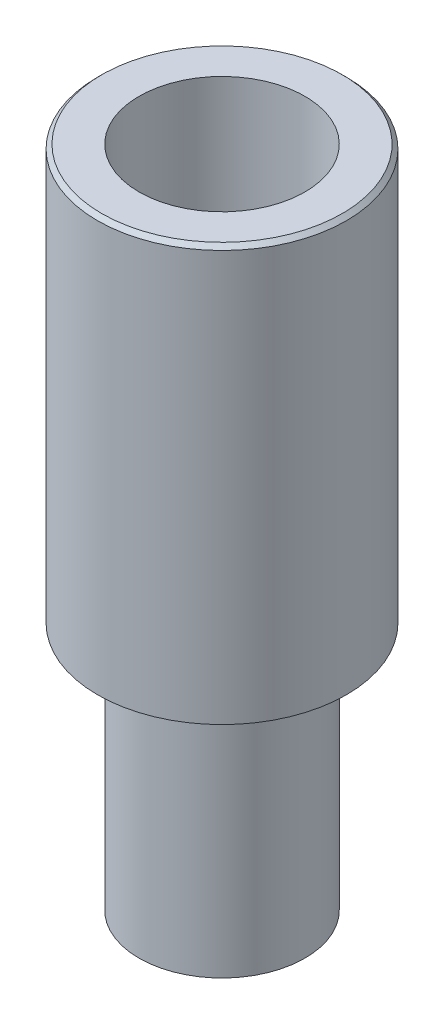
ISO-10303-21;
HEADER;
FILE_DESCRIPTION(('STEP AP214'),'2;1');
FILE_NAME('part.step','',(''),(''),'','','');
FILE_SCHEMA(('AUTOMOTIVE_DESIGN { 1 0 10303 214 1 1 1 1 }'));
ENDSEC;
DATA;
#1=APPLICATION_CONTEXT('core data for automotive mechanical design processes');
#2=APPLICATION_PROTOCOL_DEFINITION('international standard','automotive_design',2000,#1);
#3=PRODUCT_CONTEXT('',#1,'mechanical');
#4=PRODUCT('Part','Part','',(#3));
#5=PRODUCT_RELATED_PRODUCT_CATEGORY('part','',(#4));
#6=PRODUCT_DEFINITION_FORMATION('','',#4);
#7=PRODUCT_DEFINITION_CONTEXT('part definition',#1,'design');
#8=PRODUCT_DEFINITION('design','',#6,#7);
#9=PRODUCT_DEFINITION_SHAPE('','',#8);
#10=(LENGTH_UNIT() NAMED_UNIT(*) SI_UNIT(.MILLI.,.METRE.));
#11=(NAMED_UNIT(*) PLANE_ANGLE_UNIT() SI_UNIT($,.RADIAN.));
#12=(NAMED_UNIT(*) SI_UNIT($,.STERADIAN.) SOLID_ANGLE_UNIT());
#13=UNCERTAINTY_MEASURE_WITH_UNIT(LENGTH_MEASURE(1.E-05),#10,'distance_accuracy_value','');
#14=(GEOMETRIC_REPRESENTATION_CONTEXT(3) GLOBAL_UNCERTAINTY_ASSIGNED_CONTEXT((#13)) GLOBAL_UNIT_ASSIGNED_CONTEXT((#10,
#11,#12)) REPRESENTATION_CONTEXT('',''));
#15=CARTESIAN_POINT('',(0.,0.,0.));
#16=DIRECTION('',(0.,0.,1.));
#17=DIRECTION('',(1.,0.,0.));
#18=AXIS2_PLACEMENT_3D('',#15,#16,#17);
#19=CARTESIAN_POINT('',(0.,6.,0.));
#20=DIRECTION('',(0.,-1.,0.));
#21=DIRECTION('',(0.,0.,-1.));
#22=AXIS2_PLACEMENT_3D('',#19,#20,#21);
#23=CYLINDRICAL_SURFACE('',#22,2.);
#24=CARTESIAN_POINT('',(0.,6.,0.));
#25=DIRECTION('',(0.,1.,0.));
#26=DIRECTION('',(0.,0.,1.));
#27=AXIS2_PLACEMENT_3D('',#24,#25,#26);
#28=CIRCLE('',#27,2.);
#29=CARTESIAN_POINT('',(0.,6.,2.));
#30=VERTEX_POINT('',#29);
#31=EDGE_CURVE('E45',#30,#30,#28,.T.);
#32=ORIENTED_EDGE('',*,*,#31,.F.);
#33=EDGE_LOOP('',(#32));
#34=FACE_BOUND('',#33,.T.);
#35=CARTESIAN_POINT('',(0.,0.,0.));
#36=DIRECTION('',(0.,1.,0.));
#37=DIRECTION('',(0.,0.,1.));
#38=AXIS2_PLACEMENT_3D('',#35,#36,#37);
#39=CIRCLE('',#38,2.);
#40=CARTESIAN_POINT('',(0.,0.,2.));
#41=VERTEX_POINT('',#40);
#42=EDGE_CURVE('E49',#41,#41,#39,.T.);
#43=ORIENTED_EDGE('',*,*,#42,.T.);
#44=EDGE_LOOP('',(#43));
#45=FACE_BOUND('',#44,.T.);
#46=ADVANCED_FACE('F33',(#34,#45),#23,.T.);
#47=CARTESIAN_POINT('',(0.,0.,0.));
#48=DIRECTION('',(0.,1.,0.));
#49=DIRECTION('',(0.,0.,1.));
#50=AXIS2_PLACEMENT_3D('',#47,#48,#49);
#51=PLANE('',#50);
#52=ORIENTED_EDGE('',*,*,#42,.F.);
#53=EDGE_LOOP('',(#52));
#54=FACE_BOUND('',#53,.T.);
#55=ADVANCED_FACE('F84',(#54),#51,.F.);
#56=CARTESIAN_POINT('',(0.,16.,0.));
#57=DIRECTION('',(0.,-1.,0.));
#58=DIRECTION('',(0.,0.,-1.));
#59=AXIS2_PLACEMENT_3D('',#56,#57,#58);
#60=CYLINDRICAL_SURFACE('',#59,3.);
#61=CARTESIAN_POINT('',(0.,15.9,0.));
#62=DIRECTION('',(0.,1.,0.));
#63=DIRECTION('',(0.,0.,1.));
#64=AXIS2_PLACEMENT_3D('',#61,#62,#63);
#65=CIRCLE('',#64,3.);
#66=CARTESIAN_POINT('',(0.,15.9,3.));
#67=VERTEX_POINT('',#66);
#68=EDGE_CURVE('E10',#67,#67,#65,.F.);
#69=ORIENTED_EDGE('',*,*,#68,.T.);
#70=EDGE_LOOP('',(#69));
#71=FACE_BOUND('',#70,.T.);
#72=CARTESIAN_POINT('',(0.,6.,0.));
#73=DIRECTION('',(0.,1.,0.));
#74=DIRECTION('',(0.,0.,1.));
#75=AXIS2_PLACEMENT_3D('',#72,#73,#74);
#76=CIRCLE('',#75,3.);
#77=CARTESIAN_POINT('',(0.,6.,3.));
#78=VERTEX_POINT('',#77);
#79=EDGE_CURVE('E53',#78,#78,#76,.T.);
#80=ORIENTED_EDGE('',*,*,#79,.T.);
#81=EDGE_LOOP('',(#80));
#82=FACE_BOUND('',#81,.T.);
#83=ADVANCED_FACE('F75',(#71,#82),#60,.T.);
#84=CARTESIAN_POINT('',(0.,16.,0.));
#85=DIRECTION('',(0.,1.,0.));
#86=DIRECTION('',(0.,0.,1.));
#87=AXIS2_PLACEMENT_3D('',#84,#85,#86);
#88=PLANE('',#87);
#89=CARTESIAN_POINT('',(0.,16.,0.));
#90=DIRECTION('',(0.,1.,0.));
#91=DIRECTION('',(0.,0.,1.));
#92=AXIS2_PLACEMENT_3D('',#89,#90,#91);
#93=CIRCLE('',#92,2.9);
#94=CARTESIAN_POINT('',(0.,16.,2.9));
#95=VERTEX_POINT('',#94);
#96=EDGE_CURVE('E41',#95,#95,#93,.T.);
#97=ORIENTED_EDGE('',*,*,#96,.T.);
#98=EDGE_LOOP('',(#97));
#99=FACE_BOUND('',#98,.T.);
#100=CARTESIAN_POINT('',(0.,16.,0.));
#101=DIRECTION('',(0.,1.,0.));
#102=DIRECTION('',(0.,0.,1.));
#103=AXIS2_PLACEMENT_3D('',#100,#101,#102);
#104=CIRCLE('',#103,2.);
#105=CARTESIAN_POINT('',(0.,16.,2.));
#106=VERTEX_POINT('',#105);
#107=EDGE_CURVE('E58',#106,#106,#104,.T.);
#108=ORIENTED_EDGE('',*,*,#107,.F.);
#109=EDGE_LOOP('',(#108));
#110=FACE_BOUND('',#109,.T.);
#111=ADVANCED_FACE('F73',(#99,#110),#88,.T.);
#112=CARTESIAN_POINT('',(0.,6.,0.));
#113=DIRECTION('',(0.,1.,0.));
#114=DIRECTION('',(0.,0.,1.));
#115=AXIS2_PLACEMENT_3D('',#112,#113,#114);
#116=PLANE('',#115);
#117=ORIENTED_EDGE('',*,*,#31,.T.);
#118=EDGE_LOOP('',(#117));
#119=FACE_BOUND('',#118,.T.);
#120=ORIENTED_EDGE('',*,*,#79,.F.);
#121=EDGE_LOOP('',(#120));
#122=FACE_BOUND('',#121,.T.);
#123=ADVANCED_FACE('F69',(#119,#122),#116,.F.);
#124=CARTESIAN_POINT('',(0.,10.,0.));
#125=DIRECTION('',(0.,1.,0.));
#126=DIRECTION('',(0.,0.,1.));
#127=AXIS2_PLACEMENT_3D('',#124,#125,#126);
#128=CYLINDRICAL_SURFACE('',#127,2.);
#129=CARTESIAN_POINT('',(0.,10.,0.));
#130=DIRECTION('',(0.,1.,0.));
#131=DIRECTION('',(0.,0.,1.));
#132=AXIS2_PLACEMENT_3D('',#129,#130,#131);
#133=CIRCLE('',#132,2.);
#134=CARTESIAN_POINT('',(0.,10.,2.));
#135=VERTEX_POINT('',#134);
#136=EDGE_CURVE('E57',#135,#135,#133,.T.);
#137=ORIENTED_EDGE('',*,*,#136,.F.);
#138=EDGE_LOOP('',(#137));
#139=FACE_BOUND('',#138,.T.);
#140=ORIENTED_EDGE('',*,*,#107,.T.);
#141=EDGE_LOOP('',(#140));
#142=FACE_BOUND('',#141,.T.);
#143=ADVANCED_FACE('F66',(#139,#142),#128,.F.);
#144=CARTESIAN_POINT('',(0.,10.,0.));
#145=DIRECTION('',(0.,1.,0.));
#146=DIRECTION('',(0.,0.,1.));
#147=AXIS2_PLACEMENT_3D('',#144,#145,#146);
#148=PLANE('',#147);
#149=ORIENTED_EDGE('',*,*,#136,.T.);
#150=EDGE_LOOP('',(#149));
#151=FACE_BOUND('',#150,.T.);
#152=ADVANCED_FACE('F64',(#151),#148,.T.);
#153=CARTESIAN_POINT('',(0.,16.,0.));
#154=DIRECTION('',(0.,-1.,0.));
#155=DIRECTION('',(0.,0.,-1.));
#156=AXIS2_PLACEMENT_3D('',#153,#154,#155);
#157=CONICAL_SURFACE('',#156,2.9,0.785398163397448);
#158=ORIENTED_EDGE('',*,*,#68,.F.);
#159=EDGE_LOOP('',(#158));
#160=FACE_BOUND('',#159,.T.);
#161=ORIENTED_EDGE('',*,*,#96,.F.);
#162=EDGE_LOOP('',(#161));
#163=FACE_BOUND('',#162,.T.);
#164=ADVANCED_FACE('F36',(#160,#163),#157,.T.);
#165=CLOSED_SHELL('',(#46,#55,#83,#111,#123,#143,#152,#164));
#166=MANIFOLD_SOLID_BREP('B2',#165);
#167=ADVANCED_BREP_SHAPE_REPRESENTATION('',(#18,#166),#14);
#168=SHAPE_DEFINITION_REPRESENTATION(#9,#167);
ENDSEC;
END-ISO-10303-21;
